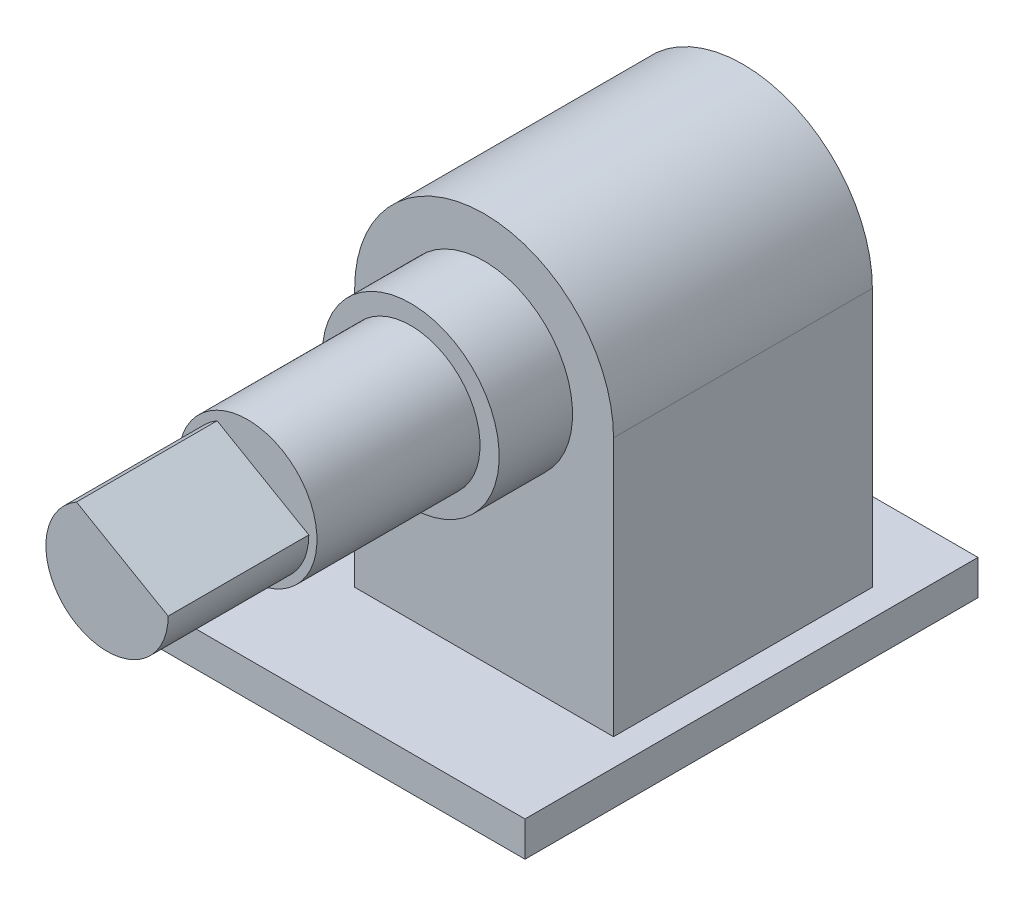
ISO-10303-21;
HEADER;
FILE_DESCRIPTION(('STEP AP214'),'2;1');
FILE_NAME('part.step','',(''),(''),'','','');
FILE_SCHEMA(('AUTOMOTIVE_DESIGN { 1 0 10303 214 1 1 1 1 }'));
ENDSEC;
DATA;
#1=APPLICATION_CONTEXT('core data for automotive mechanical design processes');
#2=APPLICATION_PROTOCOL_DEFINITION('international standard','automotive_design',2000,#1);
#3=PRODUCT_CONTEXT('',#1,'mechanical');
#4=PRODUCT('Part','Part','',(#3));
#5=PRODUCT_RELATED_PRODUCT_CATEGORY('part','',(#4));
#6=PRODUCT_DEFINITION_FORMATION('','',#4);
#7=PRODUCT_DEFINITION_CONTEXT('part definition',#1,'design');
#8=PRODUCT_DEFINITION('design','',#6,#7);
#9=PRODUCT_DEFINITION_SHAPE('','',#8);
#10=(LENGTH_UNIT() NAMED_UNIT(*) SI_UNIT(.MILLI.,.METRE.));
#11=(NAMED_UNIT(*) PLANE_ANGLE_UNIT() SI_UNIT($,.RADIAN.));
#12=(NAMED_UNIT(*) SI_UNIT($,.STERADIAN.) SOLID_ANGLE_UNIT());
#13=UNCERTAINTY_MEASURE_WITH_UNIT(LENGTH_MEASURE(1.E-05),#10,'distance_accuracy_value','');
#14=(GEOMETRIC_REPRESENTATION_CONTEXT(3) GLOBAL_UNCERTAINTY_ASSIGNED_CONTEXT((#13)) GLOBAL_UNIT_ASSIGNED_CONTEXT((#10,
#11,#12)) REPRESENTATION_CONTEXT('',''));
#15=CARTESIAN_POINT('',(0.,0.,0.));
#16=DIRECTION('',(0.,0.,1.));
#17=DIRECTION('',(1.,0.,0.));
#18=AXIS2_PLACEMENT_3D('',#15,#16,#17);
#19=CARTESIAN_POINT('',(1.9812,14.4145,-7.2517));
#20=DIRECTION('',(0.,0.,-1.));
#21=DIRECTION('',(-1.,0.,0.));
#22=AXIS2_PLACEMENT_3D('',#19,#20,#21);
#23=CYLINDRICAL_SURFACE('',#22,6.35);
#24=DIRECTION('',(0.,0.,-1.));
#25=VECTOR('',#24,1.);
#26=CARTESIAN_POINT('',(8.3312,14.4145,5.4483));
#27=LINE('',#26,#25);
#28=CARTESIAN_POINT('',(8.3312,14.4145,-7.2517));
#29=VERTEX_POINT('',#28);
#30=CARTESIAN_POINT('',(8.3312,14.4145,5.4483));
#31=VERTEX_POINT('',#30);
#32=EDGE_CURVE('E182',#29,#31,#27,.F.);
#33=ORIENTED_EDGE('',*,*,#32,.F.);
#34=CARTESIAN_POINT('',(1.9812,14.4145,-7.2517));
#35=DIRECTION('',(0.,0.,1.));
#36=DIRECTION('',(1.,0.,0.));
#37=AXIS2_PLACEMENT_3D('',#34,#35,#36);
#38=CIRCLE('',#37,6.35);
#39=CARTESIAN_POINT('',(-4.3688,14.4145,-7.2517));
#40=VERTEX_POINT('',#39);
#41=EDGE_CURVE('E43',#40,#29,#38,.F.);
#42=ORIENTED_EDGE('',*,*,#41,.F.);
#43=DIRECTION('',(0.,0.,-1.));
#44=VECTOR('',#43,1.);
#45=CARTESIAN_POINT('',(-4.3688,14.4145,5.4483));
#46=LINE('',#45,#44);
#47=CARTESIAN_POINT('',(-4.3688,14.4145,5.4483));
#48=VERTEX_POINT('',#47);
#49=EDGE_CURVE('E185',#48,#40,#46,.T.);
#50=ORIENTED_EDGE('',*,*,#49,.F.);
#51=CARTESIAN_POINT('',(1.9812,14.4145,5.4483));
#52=DIRECTION('',(0.,0.,-1.));
#53=DIRECTION('',(-1.,0.,0.));
#54=AXIS2_PLACEMENT_3D('',#51,#52,#53);
#55=CIRCLE('',#54,6.35);
#56=EDGE_CURVE('E11',#31,#48,#55,.F.);
#57=ORIENTED_EDGE('',*,*,#56,.F.);
#58=EDGE_LOOP('',(#33,#42,#50,#57));
#59=FACE_BOUND('',#58,.T.);
#60=ADVANCED_FACE('F35',(#59),#23,.T.);
#61=CARTESIAN_POINT('',(0.,1.7145,0.));
#62=DIRECTION('',(0.,-1.,0.));
#63=DIRECTION('',(0.,0.,-1.));
#64=AXIS2_PLACEMENT_3D('',#61,#62,#63);
#65=PLANE('',#64);
#66=DIRECTION('',(0.,0.,1.));
#67=VECTOR('',#66,1.);
#68=CARTESIAN_POINT('',(-9.652,1.7145,-11.1125));
#69=LINE('',#68,#67);
#70=CARTESIAN_POINT('',(-9.652,1.7145,-11.1125));
#71=VERTEX_POINT('',#70);
#72=CARTESIAN_POINT('',(-9.652,1.7145,11.1125));
#73=VERTEX_POINT('',#72);
#74=EDGE_CURVE('E153',#71,#73,#69,.T.);
#75=ORIENTED_EDGE('',*,*,#74,.T.);
#76=DIRECTION('',(1.,0.,0.));
#77=VECTOR('',#76,1.);
#78=CARTESIAN_POINT('',(9.652,1.7145,11.1125));
#79=LINE('',#78,#77);
#80=CARTESIAN_POINT('',(9.652,1.7145,11.1125));
#81=VERTEX_POINT('',#80);
#82=EDGE_CURVE('E156',#73,#81,#79,.T.);
#83=ORIENTED_EDGE('',*,*,#82,.T.);
#84=DIRECTION('',(0.,0.,-1.));
#85=VECTOR('',#84,1.);
#86=CARTESIAN_POINT('',(9.652,1.7145,-11.1125));
#87=LINE('',#86,#85);
#88=CARTESIAN_POINT('',(9.652,1.7145,-11.1125));
#89=VERTEX_POINT('',#88);
#90=EDGE_CURVE('E159',#81,#89,#87,.T.);
#91=ORIENTED_EDGE('',*,*,#90,.T.);
#92=DIRECTION('',(-1.,0.,0.));
#93=VECTOR('',#92,1.);
#94=CARTESIAN_POINT('',(9.652,1.7145,-11.1125));
#95=LINE('',#94,#93);
#96=EDGE_CURVE('E161',#89,#71,#95,.T.);
#97=ORIENTED_EDGE('',*,*,#96,.T.);
#98=EDGE_LOOP('',(#75,#83,#91,#97));
#99=FACE_BOUND('',#98,.T.);
#100=DIRECTION('',(0.,0.,1.));
#101=VECTOR('',#100,1.);
#102=CARTESIAN_POINT('',(-4.3688,1.7145,5.4483));
#103=LINE('',#102,#101);
#104=CARTESIAN_POINT('',(-4.3688,1.7145,-7.2517));
#105=VERTEX_POINT('',#104);
#106=CARTESIAN_POINT('',(-4.3688,1.7145,5.4483));
#107=VERTEX_POINT('',#106);
#108=EDGE_CURVE('E126',#105,#107,#103,.T.);
#109=ORIENTED_EDGE('',*,*,#108,.F.);
#110=DIRECTION('',(-1.,0.,0.));
#111=VECTOR('',#110,1.);
#112=CARTESIAN_POINT('',(-4.3688,1.7145,-7.2517));
#113=LINE('',#112,#111);
#114=CARTESIAN_POINT('',(8.3312,1.7145,-7.2517));
#115=VERTEX_POINT('',#114);
#116=EDGE_CURVE('E141',#115,#105,#113,.T.);
#117=ORIENTED_EDGE('',*,*,#116,.F.);
#118=DIRECTION('',(0.,0.,-1.));
#119=VECTOR('',#118,1.);
#120=CARTESIAN_POINT('',(8.3312,1.7145,5.4483));
#121=LINE('',#120,#119);
#122=CARTESIAN_POINT('',(8.3312,1.7145,5.4483));
#123=VERTEX_POINT('',#122);
#124=EDGE_CURVE('E138',#123,#115,#121,.T.);
#125=ORIENTED_EDGE('',*,*,#124,.F.);
#126=DIRECTION('',(1.,0.,0.));
#127=VECTOR('',#126,1.);
#128=CARTESIAN_POINT('',(-4.3688,1.7145,5.4483));
#129=LINE('',#128,#127);
#130=EDGE_CURVE('E130',#107,#123,#129,.T.);
#131=ORIENTED_EDGE('',*,*,#130,.F.);
#132=EDGE_LOOP('',(#109,#117,#125,#131));
#133=FACE_BOUND('',#132,.T.);
#134=ADVANCED_FACE('F198',(#99,#133),#65,.F.);
#135=CARTESIAN_POINT('',(-9.652,1.7145,-11.1125));
#136=DIRECTION('',(1.,0.,0.));
#137=DIRECTION('',(0.,0.,-1.));
#138=AXIS2_PLACEMENT_3D('',#135,#136,#137);
#139=PLANE('',#138);
#140=DIRECTION('',(0.,0.,1.));
#141=VECTOR('',#140,1.);
#142=CARTESIAN_POINT('',(-9.652,0.,-11.1125));
#143=LINE('',#142,#141);
#144=CARTESIAN_POINT('',(-9.652,0.,-11.1125));
#145=VERTEX_POINT('',#144);
#146=CARTESIAN_POINT('',(-9.652,0.,11.1125));
#147=VERTEX_POINT('',#146);
#148=EDGE_CURVE('E152',#145,#147,#143,.T.);
#149=ORIENTED_EDGE('',*,*,#148,.T.);
#150=DIRECTION('',(0.,-1.,0.));
#151=VECTOR('',#150,1.);
#152=CARTESIAN_POINT('',(-9.652,1.7145,11.1125));
#153=LINE('',#152,#151);
#154=EDGE_CURVE('E179',#73,#147,#153,.T.);
#155=ORIENTED_EDGE('',*,*,#154,.F.);
#156=ORIENTED_EDGE('',*,*,#74,.F.);
#157=DIRECTION('',(0.,-1.,0.));
#158=VECTOR('',#157,1.);
#159=CARTESIAN_POINT('',(-9.652,1.7145,-11.1125));
#160=LINE('',#159,#158);
#161=EDGE_CURVE('E163',#71,#145,#160,.T.);
#162=ORIENTED_EDGE('',*,*,#161,.T.);
#163=EDGE_LOOP('',(#149,#155,#156,#162));
#164=FACE_BOUND('',#163,.T.);
#165=ADVANCED_FACE('F221',(#164),#139,.F.);
#166=CARTESIAN_POINT('',(9.652,1.7145,11.1125));
#167=DIRECTION('',(0.,0.,-1.));
#168=DIRECTION('',(-1.,0.,0.));
#169=AXIS2_PLACEMENT_3D('',#166,#167,#168);
#170=PLANE('',#169);
#171=DIRECTION('',(1.,0.,0.));
#172=VECTOR('',#171,1.);
#173=CARTESIAN_POINT('',(9.652,0.,11.1125));
#174=LINE('',#173,#172);
#175=CARTESIAN_POINT('',(9.652,0.,11.1125));
#176=VERTEX_POINT('',#175);
#177=EDGE_CURVE('E166',#147,#176,#174,.T.);
#178=ORIENTED_EDGE('',*,*,#177,.T.);
#179=DIRECTION('',(0.,-1.,0.));
#180=VECTOR('',#179,1.);
#181=CARTESIAN_POINT('',(9.652,1.7145,11.1125));
#182=LINE('',#181,#180);
#183=EDGE_CURVE('E176',#81,#176,#182,.T.);
#184=ORIENTED_EDGE('',*,*,#183,.F.);
#185=ORIENTED_EDGE('',*,*,#82,.F.);
#186=ORIENTED_EDGE('',*,*,#154,.T.);
#187=EDGE_LOOP('',(#178,#184,#185,#186));
#188=FACE_BOUND('',#187,.T.);
#189=ADVANCED_FACE('F226',(#188),#170,.F.);
#190=CARTESIAN_POINT('',(9.652,1.7145,-11.1125));
#191=DIRECTION('',(-1.,0.,0.));
#192=DIRECTION('',(0.,0.,1.));
#193=AXIS2_PLACEMENT_3D('',#190,#191,#192);
#194=PLANE('',#193);
#195=DIRECTION('',(0.,0.,-1.));
#196=VECTOR('',#195,1.);
#197=CARTESIAN_POINT('',(9.652,0.,-11.1125));
#198=LINE('',#197,#196);
#199=CARTESIAN_POINT('',(9.652,0.,-11.1125));
#200=VERTEX_POINT('',#199);
#201=EDGE_CURVE('E168',#176,#200,#198,.T.);
#202=ORIENTED_EDGE('',*,*,#201,.T.);
#203=DIRECTION('',(0.,-1.,0.));
#204=VECTOR('',#203,1.);
#205=CARTESIAN_POINT('',(9.652,1.7145,-11.1125));
#206=LINE('',#205,#204);
#207=EDGE_CURVE('E173',#89,#200,#206,.T.);
#208=ORIENTED_EDGE('',*,*,#207,.F.);
#209=ORIENTED_EDGE('',*,*,#90,.F.);
#210=ORIENTED_EDGE('',*,*,#183,.T.);
#211=EDGE_LOOP('',(#202,#208,#209,#210));
#212=FACE_BOUND('',#211,.T.);
#213=ADVANCED_FACE('F231',(#212),#194,.F.);
#214=CARTESIAN_POINT('',(9.652,1.7145,-11.1125));
#215=DIRECTION('',(0.,0.,1.));
#216=DIRECTION('',(1.,0.,0.));
#217=AXIS2_PLACEMENT_3D('',#214,#215,#216);
#218=PLANE('',#217);
#219=DIRECTION('',(-1.,0.,0.));
#220=VECTOR('',#219,1.);
#221=CARTESIAN_POINT('',(9.652,0.,-11.1125));
#222=LINE('',#221,#220);
#223=EDGE_CURVE('E157',#200,#145,#222,.T.);
#224=ORIENTED_EDGE('',*,*,#223,.T.);
#225=ORIENTED_EDGE('',*,*,#161,.F.);
#226=ORIENTED_EDGE('',*,*,#96,.F.);
#227=ORIENTED_EDGE('',*,*,#207,.T.);
#228=EDGE_LOOP('',(#224,#225,#226,#227));
#229=FACE_BOUND('',#228,.T.);
#230=ADVANCED_FACE('F213',(#229),#218,.F.);
#231=CARTESIAN_POINT('',(0.,0.,0.));
#232=DIRECTION('',(0.,-1.,0.));
#233=DIRECTION('',(0.,0.,-1.));
#234=AXIS2_PLACEMENT_3D('',#231,#232,#233);
#235=PLANE('',#234);
#236=ORIENTED_EDGE('',*,*,#148,.F.);
#237=ORIENTED_EDGE('',*,*,#223,.F.);
#238=ORIENTED_EDGE('',*,*,#201,.F.);
#239=ORIENTED_EDGE('',*,*,#177,.F.);
#240=EDGE_LOOP('',(#236,#237,#238,#239));
#241=FACE_BOUND('',#240,.T.);
#242=ADVANCED_FACE('F205',(#241),#235,.T.);
#243=CARTESIAN_POINT('',(-4.3688,20.7645,5.4483));
#244=DIRECTION('',(1.,0.,0.));
#245=DIRECTION('',(0.,0.,-1.));
#246=AXIS2_PLACEMENT_3D('',#243,#244,#245);
#247=PLANE('',#246);
#248=DIRECTION('',(0.,-1.,0.));
#249=VECTOR('',#248,1.);
#250=CARTESIAN_POINT('',(-4.3688,20.7645,5.4483));
#251=LINE('',#250,#249);
#252=EDGE_CURVE('E150',#48,#107,#251,.T.);
#253=ORIENTED_EDGE('',*,*,#252,.F.);
#254=ORIENTED_EDGE('',*,*,#49,.T.);
#255=DIRECTION('',(0.,-1.,0.));
#256=VECTOR('',#255,1.);
#257=CARTESIAN_POINT('',(-4.3688,20.7645,-7.2517));
#258=LINE('',#257,#256);
#259=EDGE_CURVE('E144',#40,#105,#258,.T.);
#260=ORIENTED_EDGE('',*,*,#259,.T.);
#261=ORIENTED_EDGE('',*,*,#108,.T.);
#262=EDGE_LOOP('',(#253,#254,#260,#261));
#263=FACE_BOUND('',#262,.T.);
#264=ADVANCED_FACE('F203',(#263),#247,.F.);
#265=CARTESIAN_POINT('',(-4.3688,20.7645,5.4483));
#266=DIRECTION('',(0.,0.,-1.));
#267=DIRECTION('',(-1.,0.,0.));
#268=AXIS2_PLACEMENT_3D('',#265,#266,#267);
#269=PLANE('',#268);
#270=CARTESIAN_POINT('',(1.9812,14.4145,5.4483));
#271=DIRECTION('',(0.,0.,-1.));
#272=DIRECTION('',(-1.,0.,0.));
#273=AXIS2_PLACEMENT_3D('',#270,#271,#272);
#274=CIRCLE('',#273,4.34);
#275=CARTESIAN_POINT('',(-2.3588,14.4145,5.4483));
#276=VERTEX_POINT('',#275);
#277=EDGE_CURVE('E378',#276,#276,#274,.T.);
#278=ORIENTED_EDGE('',*,*,#277,.T.);
#279=EDGE_LOOP('',(#278));
#280=FACE_BOUND('',#279,.T.);
#281=DIRECTION('',(0.,-1.,0.));
#282=VECTOR('',#281,1.);
#283=CARTESIAN_POINT('',(8.3312,20.7645,5.4483));
#284=LINE('',#283,#282);
#285=EDGE_CURVE('E148',#31,#123,#284,.T.);
#286=ORIENTED_EDGE('',*,*,#285,.F.);
#287=ORIENTED_EDGE('',*,*,#56,.T.);
#288=ORIENTED_EDGE('',*,*,#252,.T.);
#289=ORIENTED_EDGE('',*,*,#130,.T.);
#290=EDGE_LOOP('',(#286,#287,#288,#289));
#291=FACE_BOUND('',#290,.T.);
#292=ADVANCED_FACE('F200',(#280,#291),#269,.F.);
#293=CARTESIAN_POINT('',(8.3312,20.7645,5.4483));
#294=DIRECTION('',(-1.,0.,0.));
#295=DIRECTION('',(0.,0.,1.));
#296=AXIS2_PLACEMENT_3D('',#293,#294,#295);
#297=PLANE('',#296);
#298=DIRECTION('',(0.,-1.,0.));
#299=VECTOR('',#298,1.);
#300=CARTESIAN_POINT('',(8.3312,20.7645,-7.2517));
#301=LINE('',#300,#299);
#302=EDGE_CURVE('E146',#29,#115,#301,.T.);
#303=ORIENTED_EDGE('',*,*,#302,.F.);
#304=ORIENTED_EDGE('',*,*,#32,.T.);
#305=ORIENTED_EDGE('',*,*,#285,.T.);
#306=ORIENTED_EDGE('',*,*,#124,.T.);
#307=EDGE_LOOP('',(#303,#304,#305,#306));
#308=FACE_BOUND('',#307,.T.);
#309=ADVANCED_FACE('F193',(#308),#297,.F.);
#310=CARTESIAN_POINT('',(-4.3688,20.7645,-7.2517));
#311=DIRECTION('',(0.,0.,1.));
#312=DIRECTION('',(1.,0.,0.));
#313=AXIS2_PLACEMENT_3D('',#310,#311,#312);
#314=PLANE('',#313);
#315=ORIENTED_EDGE('',*,*,#259,.F.);
#316=ORIENTED_EDGE('',*,*,#41,.T.);
#317=ORIENTED_EDGE('',*,*,#302,.T.);
#318=ORIENTED_EDGE('',*,*,#116,.T.);
#319=EDGE_LOOP('',(#315,#316,#317,#318));
#320=FACE_BOUND('',#319,.T.);
#321=ADVANCED_FACE('F188',(#320),#314,.F.);
#322=CARTESIAN_POINT('',(1.9812,14.4145,23.9483));
#323=DIRECTION('',(0.,0.,1.));
#324=DIRECTION('',(1.,0.,0.));
#325=AXIS2_PLACEMENT_3D('',#322,#323,#324);
#326=PLANE('',#325);
#327=DIRECTION('',(0.866025403784442,-0.499999999999994,0.));
#328=VECTOR('',#327,1.);
#329=CARTESIAN_POINT('',(0.481199999999985,17.0125762113533,23.9483));
#330=LINE('',#329,#328);
#331=CARTESIAN_POINT('',(0.481199999999985,17.0125762113533,23.9483));
#332=VERTEX_POINT('',#331);
#333=CARTESIAN_POINT('',(4.9812,14.4145,23.9483));
#334=VERTEX_POINT('',#333);
#335=EDGE_CURVE('E113',#332,#334,#330,.T.);
#336=ORIENTED_EDGE('',*,*,#335,.F.);
#337=CARTESIAN_POINT('',(1.9812,14.4145,23.9483));
#338=DIRECTION('',(0.,0.,-1.));
#339=DIRECTION('',(-1.,0.,0.));
#340=AXIS2_PLACEMENT_3D('',#337,#338,#339);
#341=CIRCLE('',#340,3.);
#342=EDGE_CURVE('E123',#334,#332,#341,.T.);
#343=ORIENTED_EDGE('',*,*,#342,.F.);
#344=EDGE_LOOP('',(#336,#343));
#345=FACE_BOUND('',#344,.T.);
#346=ADVANCED_FACE('F122',(#345),#326,.T.);
#347=CARTESIAN_POINT('',(1.9812,14.4145,5.4483));
#348=DIRECTION('',(0.,0.,-1.));
#349=DIRECTION('',(-1.,0.,0.));
#350=AXIS2_PLACEMENT_3D('',#347,#348,#349);
#351=CYLINDRICAL_SURFACE('',#350,3.);
#352=DIRECTION('',(0.,0.,1.));
#353=VECTOR('',#352,1.);
#354=CARTESIAN_POINT('',(0.481199999999985,17.0125762113533,11.639973086804));
#355=LINE('',#354,#353);
#356=CARTESIAN_POINT('',(0.481199999999985,17.0125762113533,17.0483));
#357=VERTEX_POINT('',#356);
#358=EDGE_CURVE('E110',#357,#332,#355,.T.);
#359=ORIENTED_EDGE('',*,*,#358,.F.);
#360=CARTESIAN_POINT('',(1.9812,14.4145,17.0483));
#361=DIRECTION('',(0.,0.,-1.));
#362=DIRECTION('',(-1.,0.,0.));
#363=AXIS2_PLACEMENT_3D('',#360,#361,#362);
#364=CIRCLE('',#363,3.);
#365=CARTESIAN_POINT('',(4.9812,14.4145,17.0483));
#366=VERTEX_POINT('',#365);
#367=EDGE_CURVE('E127',#366,#357,#364,.T.);
#368=ORIENTED_EDGE('',*,*,#367,.F.);
#369=DIRECTION('',(0.,0.,1.));
#370=VECTOR('',#369,1.);
#371=CARTESIAN_POINT('',(4.9812,14.4145,11.639973086804));
#372=LINE('',#371,#370);
#373=EDGE_CURVE('E118',#366,#334,#372,.T.);
#374=ORIENTED_EDGE('',*,*,#373,.T.);
#375=ORIENTED_EDGE('',*,*,#342,.T.);
#376=EDGE_LOOP('',(#359,#368,#374,#375));
#377=FACE_BOUND('',#376,.T.);
#378=ADVANCED_FACE('F125',(#377),#351,.T.);
#379=CARTESIAN_POINT('',(-1.0188,14.4145,17.0483));
#380=DIRECTION('',(0.,0.,1.));
#381=DIRECTION('',(1.,0.,0.));
#382=AXIS2_PLACEMENT_3D('',#379,#380,#381);
#383=PLANE('',#382);
#384=ORIENTED_EDGE('',*,*,#367,.T.);
#385=DIRECTION('',(-0.866025403784442,0.499999999999994,0.));
#386=VECTOR('',#385,1.);
#387=CARTESIAN_POINT('',(0.481199999999986,17.0125762113533,17.0483));
#388=LINE('',#387,#386);
#389=EDGE_CURVE('E49',#366,#357,#388,.T.);
#390=ORIENTED_EDGE('',*,*,#389,.F.);
#391=EDGE_LOOP('',(#384,#390));
#392=FACE_BOUND('',#391,.T.);
#393=CARTESIAN_POINT('',(1.9812,14.4145,17.0483));
#394=DIRECTION('',(0.,0.,-1.));
#395=DIRECTION('',(-1.,0.,0.));
#396=AXIS2_PLACEMENT_3D('',#393,#394,#395);
#397=CIRCLE('',#396,3.4);
#398=CARTESIAN_POINT('',(-1.4188,14.4145,17.0483));
#399=VERTEX_POINT('',#398);
#400=EDGE_CURVE('E132',#399,#399,#397,.T.);
#401=ORIENTED_EDGE('',*,*,#400,.F.);
#402=EDGE_LOOP('',(#401));
#403=FACE_BOUND('',#402,.T.);
#404=ADVANCED_FACE('F311',(#392,#403),#383,.T.);
#405=CARTESIAN_POINT('',(1.9812,14.4145,5.4483));
#406=DIRECTION('',(0.,0.,-1.));
#407=DIRECTION('',(-1.,0.,0.));
#408=AXIS2_PLACEMENT_3D('',#405,#406,#407);
#409=CYLINDRICAL_SURFACE('',#408,3.4);
#410=ORIENTED_EDGE('',*,*,#400,.T.);
#411=EDGE_LOOP('',(#410));
#412=FACE_BOUND('',#411,.T.);
#413=CARTESIAN_POINT('',(1.9812,14.4145,9.0483));
#414=DIRECTION('',(0.,0.,-1.));
#415=DIRECTION('',(-1.,0.,0.));
#416=AXIS2_PLACEMENT_3D('',#413,#414,#415);
#417=CIRCLE('',#416,3.4);
#418=CARTESIAN_POINT('',(-1.4188,14.4145,9.0483));
#419=VERTEX_POINT('',#418);
#420=EDGE_CURVE('E371',#419,#419,#417,.T.);
#421=ORIENTED_EDGE('',*,*,#420,.F.);
#422=EDGE_LOOP('',(#421));
#423=FACE_BOUND('',#422,.T.);
#424=ADVANCED_FACE('F305',(#412,#423),#409,.T.);
#425=CARTESIAN_POINT('',(-1.4188,14.4145,9.0483));
#426=DIRECTION('',(0.,0.,1.));
#427=DIRECTION('',(1.,0.,0.));
#428=AXIS2_PLACEMENT_3D('',#425,#426,#427);
#429=PLANE('',#428);
#430=ORIENTED_EDGE('',*,*,#420,.T.);
#431=EDGE_LOOP('',(#430));
#432=FACE_BOUND('',#431,.T.);
#433=CARTESIAN_POINT('',(1.9812,14.4145,9.0483));
#434=DIRECTION('',(0.,0.,-1.));
#435=DIRECTION('',(-1.,0.,0.));
#436=AXIS2_PLACEMENT_3D('',#433,#434,#435);
#437=CIRCLE('',#436,4.34);
#438=CARTESIAN_POINT('',(-2.3588,14.4145,9.0483));
#439=VERTEX_POINT('',#438);
#440=EDGE_CURVE('E373',#439,#439,#437,.T.);
#441=ORIENTED_EDGE('',*,*,#440,.F.);
#442=EDGE_LOOP('',(#441));
#443=FACE_BOUND('',#442,.T.);
#444=ADVANCED_FACE('F310',(#432,#443),#429,.T.);
#445=CARTESIAN_POINT('',(1.9812,14.4145,5.4483));
#446=DIRECTION('',(0.,0.,-1.));
#447=DIRECTION('',(-1.,0.,0.));
#448=AXIS2_PLACEMENT_3D('',#445,#446,#447);
#449=CYLINDRICAL_SURFACE('',#448,4.34);
#450=ORIENTED_EDGE('',*,*,#440,.T.);
#451=EDGE_LOOP('',(#450));
#452=FACE_BOUND('',#451,.T.);
#453=ORIENTED_EDGE('',*,*,#277,.F.);
#454=EDGE_LOOP('',(#453));
#455=FACE_BOUND('',#454,.T.);
#456=ADVANCED_FACE('F323',(#452,#455),#449,.T.);
#457=CARTESIAN_POINT('',(0.481199999999985,17.0125762113533,11.639973086804));
#458=DIRECTION('',(-0.499999999999994,-0.866025403784442,0.));
#459=DIRECTION('',(0.866025403784442,-0.499999999999994,0.));
#460=AXIS2_PLACEMENT_3D('',#457,#458,#459);
#461=PLANE('',#460);
#462=ORIENTED_EDGE('',*,*,#389,.T.);
#463=ORIENTED_EDGE('',*,*,#358,.T.);
#464=ORIENTED_EDGE('',*,*,#335,.T.);
#465=ORIENTED_EDGE('',*,*,#373,.F.);
#466=EDGE_LOOP('',(#462,#463,#464,#465));
#467=FACE_BOUND('',#466,.T.);
#468=ADVANCED_FACE('F112',(#467),#461,.F.);
#469=CLOSED_SHELL('',(#60,#134,#165,#189,#213,#230,#242,#264,#292,#309,#321,#346,#378,#404,#424,
#444,#456,#468));
#470=MANIFOLD_SOLID_BREP('B2',#469);
#471=ADVANCED_BREP_SHAPE_REPRESENTATION('',(#18,#470),#14);
#472=SHAPE_DEFINITION_REPRESENTATION(#9,#471);
ENDSEC;
END-ISO-10303-21;
